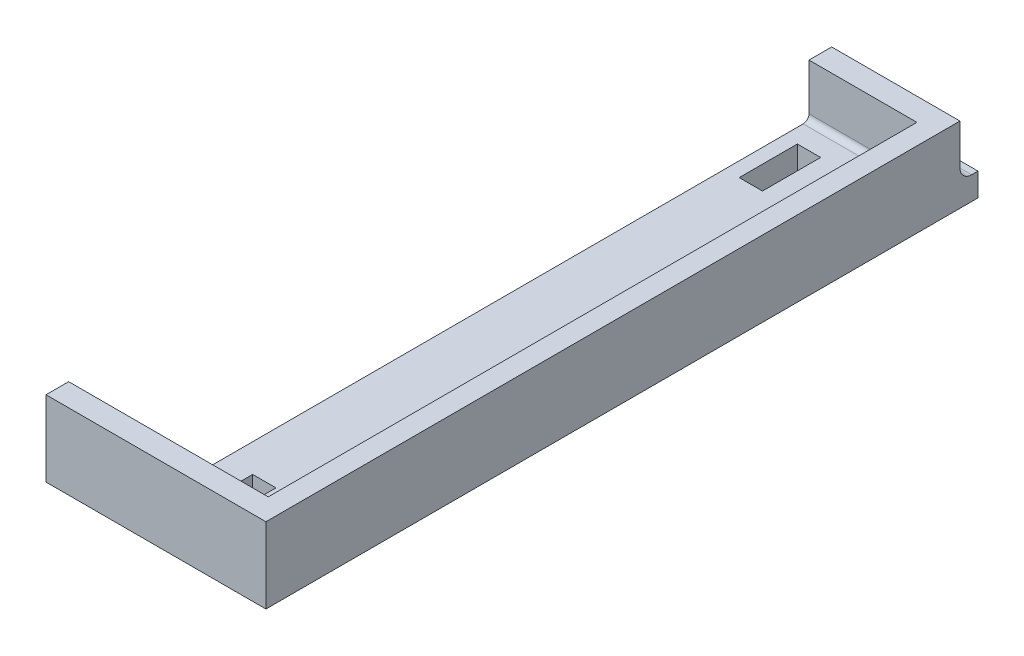
ISO-10303-21;
HEADER;
FILE_DESCRIPTION(('STEP AP214'),'2;1');
FILE_NAME('part.step','',(''),(''),'','','');
FILE_SCHEMA(('AUTOMOTIVE_DESIGN { 1 0 10303 214 1 1 1 1 }'));
ENDSEC;
DATA;
#1=APPLICATION_CONTEXT('core data for automotive mechanical design processes');
#2=APPLICATION_PROTOCOL_DEFINITION('international standard','automotive_design',2000,#1);
#3=PRODUCT_CONTEXT('',#1,'mechanical');
#4=PRODUCT('Part','Part','',(#3));
#5=PRODUCT_RELATED_PRODUCT_CATEGORY('part','',(#4));
#6=PRODUCT_DEFINITION_FORMATION('','',#4);
#7=PRODUCT_DEFINITION_CONTEXT('part definition',#1,'design');
#8=PRODUCT_DEFINITION('design','',#6,#7);
#9=PRODUCT_DEFINITION_SHAPE('','',#8);
#10=(LENGTH_UNIT() NAMED_UNIT(*) SI_UNIT(.MILLI.,.METRE.));
#11=(NAMED_UNIT(*) PLANE_ANGLE_UNIT() SI_UNIT($,.RADIAN.));
#12=(NAMED_UNIT(*) SI_UNIT($,.STERADIAN.) SOLID_ANGLE_UNIT());
#13=UNCERTAINTY_MEASURE_WITH_UNIT(LENGTH_MEASURE(1.E-05),#10,'distance_accuracy_value','');
#14=(GEOMETRIC_REPRESENTATION_CONTEXT(3) GLOBAL_UNCERTAINTY_ASSIGNED_CONTEXT((#13)) GLOBAL_UNIT_ASSIGNED_CONTEXT((#10,
#11,#12)) REPRESENTATION_CONTEXT('',''));
#15=CARTESIAN_POINT('',(0.,0.,0.));
#16=DIRECTION('',(0.,0.,1.));
#17=DIRECTION('',(1.,0.,0.));
#18=AXIS2_PLACEMENT_3D('',#15,#16,#17);
#19=CARTESIAN_POINT('',(15.75,-4.,-132.4));
#20=DIRECTION('',(-1.,0.,0.));
#21=DIRECTION('',(0.,0.,1.));
#22=AXIS2_PLACEMENT_3D('',#19,#20,#21);
#23=PLANE('',#22);
#24=DIRECTION('',(0.,0.,1.));
#25=VECTOR('',#24,1.);
#26=CARTESIAN_POINT('',(15.75,0.,-132.4));
#27=LINE('',#26,#25);
#28=CARTESIAN_POINT('',(15.75,0.,-122.4));
#29=VERTEX_POINT('',#28);
#30=CARTESIAN_POINT('',(15.75,0.,-121.3));
#31=VERTEX_POINT('',#30);
#32=EDGE_CURVE('E201',#29,#31,#27,.T.);
#33=ORIENTED_EDGE('',*,*,#32,.F.);
#34=DIRECTION('',(0.,-1.,0.));
#35=VECTOR('',#34,1.);
#36=CARTESIAN_POINT('',(15.75,-4.,-122.4));
#37=LINE('',#36,#35);
#38=CARTESIAN_POINT('',(15.75,-4.,-122.4));
#39=VERTEX_POINT('',#38);
#40=EDGE_CURVE('E48',#29,#39,#37,.T.);
#41=ORIENTED_EDGE('',*,*,#40,.T.);
#42=DIRECTION('',(0.,0.,1.));
#43=VECTOR('',#42,1.);
#44=CARTESIAN_POINT('',(15.75,-4.,-132.4));
#45=LINE('',#44,#43);
#46=CARTESIAN_POINT('',(15.75,-4.,-3.9));
#47=VERTEX_POINT('',#46);
#48=EDGE_CURVE('E308',#39,#47,#45,.T.);
#49=ORIENTED_EDGE('',*,*,#48,.T.);
#50=DIRECTION('',(0.,1.,0.));
#51=VECTOR('',#50,1.);
#52=CARTESIAN_POINT('',(15.75,-4.,-3.9));
#53=LINE('',#52,#51);
#54=CARTESIAN_POINT('',(15.75,1.,-3.90000000000001));
#55=VERTEX_POINT('',#54);
#56=EDGE_CURVE('E281',#47,#55,#53,.T.);
#57=ORIENTED_EDGE('',*,*,#56,.T.);
#58=CARTESIAN_POINT('',(15.75,1.,-4.9));
#59=DIRECTION('',(-1.,0.,0.));
#60=DIRECTION('',(0.,0.,1.));
#61=AXIS2_PLACEMENT_3D('',#58,#59,#60);
#62=CIRCLE('',#61,1.);
#63=CARTESIAN_POINT('',(15.75,0.,-4.90000000000002));
#64=VERTEX_POINT('',#63);
#65=EDGE_CURVE('E267',#64,#55,#62,.T.);
#66=ORIENTED_EDGE('',*,*,#65,.F.);
#67=CARTESIAN_POINT('',(15.75,0.,-114.4));
#68=VERTEX_POINT('',#67);
#69=EDGE_CURVE('E197',#68,#64,#27,.T.);
#70=ORIENTED_EDGE('',*,*,#69,.F.);
#71=CARTESIAN_POINT('',(15.75,1.,-114.4));
#72=DIRECTION('',(-1.,0.,0.));
#73=DIRECTION('',(0.,0.,1.));
#74=AXIS2_PLACEMENT_3D('',#71,#72,#73);
#75=CIRCLE('',#74,1.);
#76=CARTESIAN_POINT('',(15.75,1.,-115.4));
#77=VERTEX_POINT('',#76);
#78=EDGE_CURVE('E41',#77,#68,#75,.T.);
#79=ORIENTED_EDGE('',*,*,#78,.F.);
#80=DIRECTION('',(0.,-1.,0.));
#81=VECTOR('',#80,1.);
#82=CARTESIAN_POINT('',(15.75,9.,-115.4));
#83=LINE('',#82,#81);
#84=CARTESIAN_POINT('',(15.75,9.,-115.4));
#85=VERTEX_POINT('',#84);
#86=EDGE_CURVE('E295',#85,#77,#83,.T.);
#87=ORIENTED_EDGE('',*,*,#86,.F.);
#88=DIRECTION('',(0.,0.,1.));
#89=VECTOR('',#88,1.);
#90=CARTESIAN_POINT('',(15.75,9.,-115.4));
#91=LINE('',#90,#89);
#92=CARTESIAN_POINT('',(15.75,9.,-119.3));
#93=VERTEX_POINT('',#92);
#94=EDGE_CURVE('E340',#93,#85,#91,.T.);
#95=ORIENTED_EDGE('',*,*,#94,.F.);
#96=DIRECTION('',(0.,-1.,0.));
#97=VECTOR('',#96,1.);
#98=CARTESIAN_POINT('',(15.75,9.,-119.3));
#99=LINE('',#98,#97);
#100=CARTESIAN_POINT('',(15.75,2.,-119.3));
#101=VERTEX_POINT('',#100);
#102=EDGE_CURVE('E204',#93,#101,#99,.T.);
#103=ORIENTED_EDGE('',*,*,#102,.T.);
#104=CARTESIAN_POINT('',(15.75,2.,-121.3));
#105=DIRECTION('',(-1.,0.,0.));
#106=DIRECTION('',(0.,0.,1.));
#107=AXIS2_PLACEMENT_3D('',#104,#105,#106);
#108=CIRCLE('',#107,2.);
#109=EDGE_CURVE('E223',#31,#101,#108,.T.);
#110=ORIENTED_EDGE('',*,*,#109,.F.);
#111=EDGE_LOOP('',(#33,#41,#49,#57,#66,#70,#79,#87,#95,#103,#110));
#112=FACE_BOUND('',#111,.T.);
#113=ADVANCED_FACE('F33',(#112),#23,.T.);
#114=CARTESIAN_POINT('',(37.8,-4.,-129.4));
#115=DIRECTION('',(1.,0.,0.));
#116=DIRECTION('',(0.,0.,-1.));
#117=AXIS2_PLACEMENT_3D('',#114,#115,#116);
#118=PLANE('',#117);
#119=DIRECTION('',(0.,0.,-1.));
#120=VECTOR('',#119,1.);
#121=CARTESIAN_POINT('',(37.8,-4.,0.));
#122=LINE('',#121,#120);
#123=CARTESIAN_POINT('',(37.8,-4.,0.));
#124=VERTEX_POINT('',#123);
#125=CARTESIAN_POINT('',(37.8,-4.,-122.4));
#126=VERTEX_POINT('',#125);
#127=EDGE_CURVE('E191',#124,#126,#122,.T.);
#128=ORIENTED_EDGE('',*,*,#127,.T.);
#129=DIRECTION('',(0.,1.,0.));
#130=VECTOR('',#129,1.);
#131=CARTESIAN_POINT('',(37.8,-4.,-122.4));
#132=LINE('',#131,#130);
#133=CARTESIAN_POINT('',(37.8,0.,-122.4));
#134=VERTEX_POINT('',#133);
#135=EDGE_CURVE('E180',#126,#134,#132,.T.);
#136=ORIENTED_EDGE('',*,*,#135,.T.);
#137=DIRECTION('',(0.,0.,-1.));
#138=VECTOR('',#137,1.);
#139=CARTESIAN_POINT('',(37.8,0.,-129.4));
#140=LINE('',#139,#138);
#141=CARTESIAN_POINT('',(37.8,0.,-121.3));
#142=VERTEX_POINT('',#141);
#143=EDGE_CURVE('E189',#142,#134,#140,.T.);
#144=ORIENTED_EDGE('',*,*,#143,.F.);
#145=CARTESIAN_POINT('',(37.8,2.,-121.3));
#146=DIRECTION('',(1.,0.,0.));
#147=DIRECTION('',(0.,0.,-1.));
#148=AXIS2_PLACEMENT_3D('',#145,#146,#147);
#149=CIRCLE('',#148,2.);
#150=CARTESIAN_POINT('',(37.8,2.,-119.3));
#151=VERTEX_POINT('',#150);
#152=EDGE_CURVE('E221',#151,#142,#149,.T.);
#153=ORIENTED_EDGE('',*,*,#152,.F.);
#154=DIRECTION('',(0.,-1.,0.));
#155=VECTOR('',#154,1.);
#156=CARTESIAN_POINT('',(37.8,9.,-119.3));
#157=LINE('',#156,#155);
#158=CARTESIAN_POINT('',(37.8,9.,-119.3));
#159=VERTEX_POINT('',#158);
#160=EDGE_CURVE('E198',#159,#151,#157,.T.);
#161=ORIENTED_EDGE('',*,*,#160,.F.);
#162=DIRECTION('',(0.,0.,-1.));
#163=VECTOR('',#162,1.);
#164=CARTESIAN_POINT('',(37.8,9.,-119.3));
#165=LINE('',#164,#163);
#166=CARTESIAN_POINT('',(37.8,9.,0.));
#167=VERTEX_POINT('',#166);
#168=EDGE_CURVE('E330',#167,#159,#165,.T.);
#169=ORIENTED_EDGE('',*,*,#168,.F.);
#170=DIRECTION('',(0.,1.,0.));
#171=VECTOR('',#170,1.);
#172=CARTESIAN_POINT('',(37.8,-4.,0.));
#173=LINE('',#172,#171);
#174=EDGE_CURVE('E216',#124,#167,#173,.T.);
#175=ORIENTED_EDGE('',*,*,#174,.F.);
#176=EDGE_LOOP('',(#128,#136,#144,#153,#161,#169,#175));
#177=FACE_BOUND('',#176,.T.);
#178=ADVANCED_FACE('F188',(#177),#118,.T.);
#179=CARTESIAN_POINT('',(0.,-4.,0.));
#180=DIRECTION('',(0.,1.,0.));
#181=DIRECTION('',(0.,0.,1.));
#182=AXIS2_PLACEMENT_3D('',#179,#180,#181);
#183=PLANE('',#182);
#184=DIRECTION('',(-1.,0.,0.));
#185=VECTOR('',#184,1.);
#186=CARTESIAN_POINT('',(0.,-4.,-14.9));
#187=LINE('',#186,#185);
#188=CARTESIAN_POINT('',(24.6202204130949,-4.,-14.9));
#189=VERTEX_POINT('',#188);
#190=CARTESIAN_POINT('',(20.6202204130949,-4.,-14.9));
#191=VERTEX_POINT('',#190);
#192=EDGE_CURVE('E231',#189,#191,#187,.T.);
#193=ORIENTED_EDGE('',*,*,#192,.T.);
#194=DIRECTION('',(-4.42680325529367E-05,0.,0.999999999020171));
#195=VECTOR('',#194,1.);
#196=CARTESIAN_POINT('',(20.6195607790019,-4.,0.000912787388686487));
#197=LINE('',#196,#195);
#198=CARTESIAN_POINT('',(20.6197795869051,-4.,-4.9418843150546));
#199=VERTEX_POINT('',#198);
#200=EDGE_CURVE('E234',#191,#199,#197,.T.);
#201=ORIENTED_EDGE('',*,*,#200,.T.);
#202=DIRECTION('',(1.,0.,0.));
#203=VECTOR('',#202,1.);
#204=CARTESIAN_POINT('',(0.,-4.,-4.9418843150546));
#205=LINE('',#204,#203);
#206=CARTESIAN_POINT('',(24.6197795869051,-4.,-4.9418843150546));
#207=VERTEX_POINT('',#206);
#208=EDGE_CURVE('E225',#199,#207,#205,.T.);
#209=ORIENTED_EDGE('',*,*,#208,.T.);
#210=DIRECTION('',(4.42680325529367E-05,0.,-0.999999999020171));
#211=VECTOR('',#210,1.);
#212=CARTESIAN_POINT('',(24.6195607711632,-4.,0.00108985951872473));
#213=LINE('',#212,#211);
#214=EDGE_CURVE('E228',#207,#189,#213,.T.);
#215=ORIENTED_EDGE('',*,*,#214,.T.);
#216=EDGE_LOOP('',(#193,#201,#209,#215));
#217=FACE_BOUND('',#216,.T.);
#218=DIRECTION('',(1.,0.,0.));
#219=VECTOR('',#218,1.);
#220=CARTESIAN_POINT('',(0.,-4.,-100.9));
#221=LINE('',#220,#219);
#222=CARTESIAN_POINT('',(18.25,-4.,-100.9));
#223=VERTEX_POINT('',#222);
#224=CARTESIAN_POINT('',(22.25,-4.,-100.9));
#225=VERTEX_POINT('',#224);
#226=EDGE_CURVE('E243',#223,#225,#221,.T.);
#227=ORIENTED_EDGE('',*,*,#226,.T.);
#228=DIRECTION('',(0.,0.,-1.));
#229=VECTOR('',#228,1.);
#230=CARTESIAN_POINT('',(22.25,-4.,0.));
#231=LINE('',#230,#229);
#232=CARTESIAN_POINT('',(22.25,-4.,-110.9));
#233=VERTEX_POINT('',#232);
#234=EDGE_CURVE('E246',#225,#233,#231,.T.);
#235=ORIENTED_EDGE('',*,*,#234,.T.);
#236=DIRECTION('',(-1.,0.,0.));
#237=VECTOR('',#236,1.);
#238=CARTESIAN_POINT('',(0.,-4.,-110.9));
#239=LINE('',#238,#237);
#240=CARTESIAN_POINT('',(18.25,-4.,-110.9));
#241=VERTEX_POINT('',#240);
#242=EDGE_CURVE('E237',#233,#241,#239,.T.);
#243=ORIENTED_EDGE('',*,*,#242,.T.);
#244=DIRECTION('',(0.,0.,1.));
#245=VECTOR('',#244,1.);
#246=CARTESIAN_POINT('',(18.25,-4.,0.));
#247=LINE('',#246,#245);
#248=EDGE_CURVE('E240',#241,#223,#247,.T.);
#249=ORIENTED_EDGE('',*,*,#248,.T.);
#250=EDGE_LOOP('',(#227,#235,#243,#249));
#251=FACE_BOUND('',#250,.T.);
#252=DIRECTION('',(-1.,0.,0.));
#253=VECTOR('',#252,1.);
#254=CARTESIAN_POINT('',(0.,-4.,-122.4));
#255=LINE('',#254,#253);
#256=EDGE_CURVE('E634',#126,#39,#255,.T.);
#257=ORIENTED_EDGE('',*,*,#256,.F.);
#258=ORIENTED_EDGE('',*,*,#127,.F.);
#259=DIRECTION('',(1.,0.,0.));
#260=VECTOR('',#259,1.);
#261=CARTESIAN_POINT('',(0.,-4.,0.));
#262=LINE('',#261,#260);
#263=CARTESIAN_POINT('',(0.,-4.,0.));
#264=VERTEX_POINT('',#263);
#265=EDGE_CURVE('E210',#264,#124,#262,.T.);
#266=ORIENTED_EDGE('',*,*,#265,.F.);
#267=DIRECTION('',(0.,0.,1.));
#268=VECTOR('',#267,1.);
#269=CARTESIAN_POINT('',(0.,-4.,0.));
#270=LINE('',#269,#268);
#271=CARTESIAN_POINT('',(0.,-4.,-3.9));
#272=VERTEX_POINT('',#271);
#273=EDGE_CURVE('E207',#272,#264,#270,.T.);
#274=ORIENTED_EDGE('',*,*,#273,.F.);
#275=DIRECTION('',(-1.,0.,0.));
#276=VECTOR('',#275,1.);
#277=CARTESIAN_POINT('',(0.,-4.,-3.9));
#278=LINE('',#277,#276);
#279=EDGE_CURVE('E309',#47,#272,#278,.T.);
#280=ORIENTED_EDGE('',*,*,#279,.F.);
#281=ORIENTED_EDGE('',*,*,#48,.F.);
#282=EDGE_LOOP('',(#257,#258,#266,#274,#280,#281));
#283=FACE_BOUND('',#282,.T.);
#284=ADVANCED_FACE('F321',(#217,#251,#283),#183,.F.);
#285=CARTESIAN_POINT('',(0.,0.,0.));
#286=DIRECTION('',(0.,1.,0.));
#287=DIRECTION('',(0.,0.,1.));
#288=AXIS2_PLACEMENT_3D('',#285,#286,#287);
#289=PLANE('',#288);
#290=ORIENTED_EDGE('',*,*,#143,.T.);
#291=DIRECTION('',(-1.,0.,0.));
#292=VECTOR('',#291,1.);
#293=CARTESIAN_POINT('',(0.,0.,-122.4));
#294=LINE('',#293,#292);
#295=EDGE_CURVE('E11',#134,#29,#294,.T.);
#296=ORIENTED_EDGE('',*,*,#295,.T.);
#297=ORIENTED_EDGE('',*,*,#32,.T.);
#298=DIRECTION('',(-1.,0.,0.));
#299=VECTOR('',#298,1.);
#300=CARTESIAN_POINT('',(0.,0.,-121.3));
#301=LINE('',#300,#299);
#302=EDGE_CURVE('E196',#31,#142,#301,.F.);
#303=ORIENTED_EDGE('',*,*,#302,.T.);
#304=EDGE_LOOP('',(#290,#296,#297,#303));
#305=FACE_BOUND('',#304,.T.);
#306=ADVANCED_FACE('F194',(#305),#289,.T.);
#307=CARTESIAN_POINT('',(33.3,1.,0.));
#308=DIRECTION('',(0.,0.,-1.));
#309=DIRECTION('',(-1.,0.,0.));
#310=AXIS2_PLACEMENT_3D('',#307,#308,#309);
#311=CYLINDRICAL_SURFACE('',#310,1.);
#312=CARTESIAN_POINT('',(33.3,1.,-114.4));
#313=DIRECTION('',(-0.707106781186548,0.,-0.707106781186547));
#314=DIRECTION('',(0.707106781186547,0.,-0.707106781186548));
#315=AXIS2_PLACEMENT_3D('',#312,#313,#314);
#316=ELLIPSE('',#315,1.41421356237309,1.);
#317=CARTESIAN_POINT('',(33.3,0.,-114.4));
#318=VERTEX_POINT('',#317);
#319=CARTESIAN_POINT('',(34.3,1.,-115.4));
#320=VERTEX_POINT('',#319);
#321=EDGE_CURVE('E272',#318,#320,#316,.F.);
#322=ORIENTED_EDGE('',*,*,#321,.F.);
#323=DIRECTION('',(0.,0.,-1.));
#324=VECTOR('',#323,1.);
#325=CARTESIAN_POINT('',(33.3,0.,0.));
#326=LINE('',#325,#324);
#327=CARTESIAN_POINT('',(33.3,0.,-4.9));
#328=VERTEX_POINT('',#327);
#329=EDGE_CURVE('E252',#328,#318,#326,.T.);
#330=ORIENTED_EDGE('',*,*,#329,.F.);
#331=CARTESIAN_POINT('',(33.3,1.,-4.9));
#332=DIRECTION('',(-0.707106781186547,0.,0.707106781186548));
#333=DIRECTION('',(-0.707106781186548,0.,-0.707106781186547));
#334=AXIS2_PLACEMENT_3D('',#331,#332,#333);
#335=ELLIPSE('',#334,1.4142135623731,1.);
#336=CARTESIAN_POINT('',(34.3,1.,-3.9));
#337=VERTEX_POINT('',#336);
#338=EDGE_CURVE('E270',#328,#337,#335,.T.);
#339=ORIENTED_EDGE('',*,*,#338,.T.);
#340=DIRECTION('',(0.,0.,-1.));
#341=VECTOR('',#340,1.);
#342=CARTESIAN_POINT('',(34.3,0.999999999999999,-115.4));
#343=LINE('',#342,#341);
#344=EDGE_CURVE('E261',#320,#337,#343,.F.);
#345=ORIENTED_EDGE('',*,*,#344,.F.);
#346=EDGE_LOOP('',(#322,#330,#339,#345));
#347=FACE_BOUND('',#346,.T.);
#348=ADVANCED_FACE('F286',(#347),#311,.F.);
#349=CARTESIAN_POINT('',(0.,1.,-4.9));
#350=DIRECTION('',(-1.,0.,0.));
#351=DIRECTION('',(0.,0.,1.));
#352=AXIS2_PLACEMENT_3D('',#349,#350,#351);
#353=CYLINDRICAL_SURFACE('',#352,1.);
#354=ORIENTED_EDGE('',*,*,#338,.F.);
#355=DIRECTION('',(1.,0.,0.));
#356=VECTOR('',#355,1.);
#357=CARTESIAN_POINT('',(0.,0.,-4.9));
#358=LINE('',#357,#356);
#359=EDGE_CURVE('E255',#64,#328,#358,.T.);
#360=ORIENTED_EDGE('',*,*,#359,.F.);
#361=ORIENTED_EDGE('',*,*,#65,.T.);
#362=DIRECTION('',(1.,0.,0.));
#363=VECTOR('',#362,1.);
#364=CARTESIAN_POINT('',(0.,1.,-3.9));
#365=LINE('',#364,#363);
#366=EDGE_CURVE('E258',#337,#55,#365,.F.);
#367=ORIENTED_EDGE('',*,*,#366,.F.);
#368=EDGE_LOOP('',(#354,#360,#361,#367));
#369=FACE_BOUND('',#368,.T.);
#370=ADVANCED_FACE('F284',(#369),#353,.F.);
#371=CARTESIAN_POINT('',(0.,1.,-114.4));
#372=DIRECTION('',(-1.,0.,0.));
#373=DIRECTION('',(0.,0.,1.));
#374=AXIS2_PLACEMENT_3D('',#371,#372,#373);
#375=CYLINDRICAL_SURFACE('',#374,1.);
#376=DIRECTION('',(-1.,0.,0.));
#377=VECTOR('',#376,1.);
#378=CARTESIAN_POINT('',(0.,0.,-114.4));
#379=LINE('',#378,#377);
#380=EDGE_CURVE('E249',#318,#68,#379,.T.);
#381=ORIENTED_EDGE('',*,*,#380,.F.);
#382=ORIENTED_EDGE('',*,*,#321,.T.);
#383=DIRECTION('',(-1.,0.,0.));
#384=VECTOR('',#383,1.);
#385=CARTESIAN_POINT('',(34.3,0.999999999999999,-115.4));
#386=LINE('',#385,#384);
#387=EDGE_CURVE('E264',#77,#320,#386,.F.);
#388=ORIENTED_EDGE('',*,*,#387,.F.);
#389=ORIENTED_EDGE('',*,*,#78,.T.);
#390=EDGE_LOOP('',(#381,#382,#388,#389));
#391=FACE_BOUND('',#390,.T.);
#392=ADVANCED_FACE('F35',(#391),#375,.F.);
#393=CARTESIAN_POINT('',(0.,-4.,-3.9));
#394=DIRECTION('',(0.,0.,-1.));
#395=DIRECTION('',(-1.,0.,0.));
#396=AXIS2_PLACEMENT_3D('',#393,#394,#395);
#397=PLANE('',#396);
#398=DIRECTION('',(0.,-1.,0.));
#399=VECTOR('',#398,1.);
#400=CARTESIAN_POINT('',(34.3,9.,-3.9));
#401=LINE('',#400,#399);
#402=CARTESIAN_POINT('',(34.3,9.,-3.9));
#403=VERTEX_POINT('',#402);
#404=EDGE_CURVE('E301',#403,#337,#401,.T.);
#405=ORIENTED_EDGE('',*,*,#404,.T.);
#406=ORIENTED_EDGE('',*,*,#366,.T.);
#407=ORIENTED_EDGE('',*,*,#56,.F.);
#408=ORIENTED_EDGE('',*,*,#279,.T.);
#409=DIRECTION('',(0.,1.,0.));
#410=VECTOR('',#409,1.);
#411=CARTESIAN_POINT('',(0.,-4.,-3.9));
#412=LINE('',#411,#410);
#413=CARTESIAN_POINT('',(0.,9.,-3.9));
#414=VERTEX_POINT('',#413);
#415=EDGE_CURVE('E214',#272,#414,#412,.T.);
#416=ORIENTED_EDGE('',*,*,#415,.T.);
#417=DIRECTION('',(-1.,0.,0.));
#418=VECTOR('',#417,1.);
#419=CARTESIAN_POINT('',(34.3,9.,-3.9));
#420=LINE('',#419,#418);
#421=EDGE_CURVE('E335',#403,#414,#420,.T.);
#422=ORIENTED_EDGE('',*,*,#421,.F.);
#423=EDGE_LOOP('',(#405,#406,#407,#408,#416,#422));
#424=FACE_BOUND('',#423,.T.);
#425=ADVANCED_FACE('F347',(#424),#397,.T.);
#426=CARTESIAN_POINT('',(15.75,2.,-121.3));
#427=DIRECTION('',(-1.,0.,0.));
#428=DIRECTION('',(0.,0.,1.));
#429=AXIS2_PLACEMENT_3D('',#426,#427,#428);
#430=CYLINDRICAL_SURFACE('',#429,2.);
#431=DIRECTION('',(-1.,0.,0.));
#432=VECTOR('',#431,1.);
#433=CARTESIAN_POINT('',(15.75,2.,-119.3));
#434=LINE('',#433,#432);
#435=EDGE_CURVE('E213',#151,#101,#434,.T.);
#436=ORIENTED_EDGE('',*,*,#435,.F.);
#437=ORIENTED_EDGE('',*,*,#152,.T.);
#438=ORIENTED_EDGE('',*,*,#302,.F.);
#439=ORIENTED_EDGE('',*,*,#109,.T.);
#440=EDGE_LOOP('',(#436,#437,#438,#439));
#441=FACE_BOUND('',#440,.T.);
#442=ADVANCED_FACE('F360',(#441),#430,.F.);
#443=DIRECTION('',(0.,0.,-1.));
#444=VECTOR('',#443,1.);
#445=CARTESIAN_POINT('',(22.25,0.,-110.9));
#446=LINE('',#445,#444);
#447=CARTESIAN_POINT('',(22.25,0.,-100.9));
#448=VERTEX_POINT('',#447);
#449=CARTESIAN_POINT('',(22.25,0.,-110.9));
#450=VERTEX_POINT('',#449);
#451=EDGE_CURVE('E622',#448,#450,#446,.T.);
#452=ORIENTED_EDGE('',*,*,#451,.F.);
#453=DIRECTION('',(1.,0.,0.));
#454=VECTOR('',#453,1.);
#455=CARTESIAN_POINT('',(18.25,0.,-100.9));
#456=LINE('',#455,#454);
#457=CARTESIAN_POINT('',(18.25,0.,-100.9));
#458=VERTEX_POINT('',#457);
#459=EDGE_CURVE('E609',#458,#448,#456,.T.);
#460=ORIENTED_EDGE('',*,*,#459,.F.);
#461=DIRECTION('',(0.,0.,1.));
#462=VECTOR('',#461,1.);
#463=CARTESIAN_POINT('',(18.25,0.,-100.9));
#464=LINE('',#463,#462);
#465=CARTESIAN_POINT('',(18.25,0.,-110.9));
#466=VERTEX_POINT('',#465);
#467=EDGE_CURVE('E616',#466,#458,#464,.T.);
#468=ORIENTED_EDGE('',*,*,#467,.F.);
#469=DIRECTION('',(-1.,0.,0.));
#470=VECTOR('',#469,1.);
#471=CARTESIAN_POINT('',(18.25,0.,-110.9));
#472=LINE('',#471,#470);
#473=EDGE_CURVE('E619',#450,#466,#472,.T.);
#474=ORIENTED_EDGE('',*,*,#473,.F.);
#475=EDGE_LOOP('',(#452,#460,#468,#474));
#476=FACE_BOUND('',#475,.T.);
#477=DIRECTION('',(-4.42680325529367E-05,0.,0.999999999020171));
#478=VECTOR('',#477,1.);
#479=CARTESIAN_POINT('',(20.6197795869051,0.,-4.9418843150546));
#480=LINE('',#479,#478);
#481=CARTESIAN_POINT('',(20.6202204130949,0.,-14.9));
#482=VERTEX_POINT('',#481);
#483=CARTESIAN_POINT('',(20.6197795869051,0.,-4.9418843150546));
#484=VERTEX_POINT('',#483);
#485=EDGE_CURVE('E631',#482,#484,#480,.T.);
#486=ORIENTED_EDGE('',*,*,#485,.F.);
#487=DIRECTION('',(-1.,0.,0.));
#488=VECTOR('',#487,1.);
#489=CARTESIAN_POINT('',(20.6202204130949,0.,-14.9));
#490=LINE('',#489,#488);
#491=CARTESIAN_POINT('',(24.6202204130949,0.,-14.9));
#492=VERTEX_POINT('',#491);
#493=EDGE_CURVE('E640',#492,#482,#490,.T.);
#494=ORIENTED_EDGE('',*,*,#493,.F.);
#495=DIRECTION('',(4.42680325529367E-05,0.,-0.999999999020171));
#496=VECTOR('',#495,1.);
#497=CARTESIAN_POINT('',(24.6202204130949,0.,-14.9));
#498=LINE('',#497,#496);
#499=CARTESIAN_POINT('',(24.6197795869051,0.,-4.9418843150546));
#500=VERTEX_POINT('',#499);
#501=EDGE_CURVE('E637',#500,#492,#498,.T.);
#502=ORIENTED_EDGE('',*,*,#501,.F.);
#503=DIRECTION('',(1.,0.,0.));
#504=VECTOR('',#503,1.);
#505=CARTESIAN_POINT('',(24.6197795869051,0.,-4.9418843150546));
#506=LINE('',#505,#504);
#507=EDGE_CURVE('E633',#484,#500,#506,.T.);
#508=ORIENTED_EDGE('',*,*,#507,.F.);
#509=EDGE_LOOP('',(#486,#494,#502,#508));
#510=FACE_BOUND('',#509,.T.);
#511=ORIENTED_EDGE('',*,*,#69,.T.);
#512=ORIENTED_EDGE('',*,*,#359,.T.);
#513=ORIENTED_EDGE('',*,*,#329,.T.);
#514=ORIENTED_EDGE('',*,*,#380,.T.);
#515=EDGE_LOOP('',(#511,#512,#513,#514));
#516=FACE_BOUND('',#515,.T.);
#517=ADVANCED_FACE('F277',(#476,#510,#516),#289,.T.);
#518=CARTESIAN_POINT('',(0.,-4.,0.));
#519=DIRECTION('',(0.,0.,1.));
#520=DIRECTION('',(1.,0.,0.));
#521=AXIS2_PLACEMENT_3D('',#518,#519,#520);
#522=PLANE('',#521);
#523=ORIENTED_EDGE('',*,*,#174,.T.);
#524=DIRECTION('',(1.,0.,0.));
#525=VECTOR('',#524,1.);
#526=CARTESIAN_POINT('',(0.,9.,0.));
#527=LINE('',#526,#525);
#528=CARTESIAN_POINT('',(0.,9.,0.));
#529=VERTEX_POINT('',#528);
#530=EDGE_CURVE('E327',#529,#167,#527,.T.);
#531=ORIENTED_EDGE('',*,*,#530,.F.);
#532=DIRECTION('',(0.,1.,0.));
#533=VECTOR('',#532,1.);
#534=CARTESIAN_POINT('',(0.,-4.,0.));
#535=LINE('',#534,#533);
#536=EDGE_CURVE('E211',#264,#529,#535,.T.);
#537=ORIENTED_EDGE('',*,*,#536,.F.);
#538=ORIENTED_EDGE('',*,*,#265,.T.);
#539=EDGE_LOOP('',(#523,#531,#537,#538));
#540=FACE_BOUND('',#539,.T.);
#541=ADVANCED_FACE('F324',(#540),#522,.T.);
#542=CARTESIAN_POINT('',(0.,-4.,0.));
#543=DIRECTION('',(-1.,0.,0.));
#544=DIRECTION('',(0.,0.,1.));
#545=AXIS2_PLACEMENT_3D('',#542,#543,#544);
#546=PLANE('',#545);
#547=ORIENTED_EDGE('',*,*,#536,.T.);
#548=DIRECTION('',(0.,0.,1.));
#549=VECTOR('',#548,1.);
#550=CARTESIAN_POINT('',(0.,9.,-3.9));
#551=LINE('',#550,#549);
#552=EDGE_CURVE('E331',#414,#529,#551,.T.);
#553=ORIENTED_EDGE('',*,*,#552,.F.);
#554=ORIENTED_EDGE('',*,*,#415,.F.);
#555=ORIENTED_EDGE('',*,*,#273,.T.);
#556=EDGE_LOOP('',(#547,#553,#554,#555));
#557=FACE_BOUND('',#556,.T.);
#558=ADVANCED_FACE('F316',(#557),#546,.T.);
#559=CARTESIAN_POINT('',(15.75,9.,-119.3));
#560=DIRECTION('',(0.,0.,1.));
#561=DIRECTION('',(1.,0.,0.));
#562=AXIS2_PLACEMENT_3D('',#559,#560,#561);
#563=PLANE('',#562);
#564=ORIENTED_EDGE('',*,*,#160,.T.);
#565=ORIENTED_EDGE('',*,*,#435,.T.);
#566=ORIENTED_EDGE('',*,*,#102,.F.);
#567=DIRECTION('',(-1.,0.,0.));
#568=VECTOR('',#567,1.);
#569=CARTESIAN_POINT('',(15.75,9.,-119.3));
#570=LINE('',#569,#568);
#571=EDGE_CURVE('E333',#159,#93,#570,.T.);
#572=ORIENTED_EDGE('',*,*,#571,.F.);
#573=EDGE_LOOP('',(#564,#565,#566,#572));
#574=FACE_BOUND('',#573,.T.);
#575=ADVANCED_FACE('F356',(#574),#563,.F.);
#576=CARTESIAN_POINT('',(34.3,9.,-115.4));
#577=DIRECTION('',(0.,0.,-1.));
#578=DIRECTION('',(-1.,0.,0.));
#579=AXIS2_PLACEMENT_3D('',#576,#577,#578);
#580=PLANE('',#579);
#581=ORIENTED_EDGE('',*,*,#86,.T.);
#582=ORIENTED_EDGE('',*,*,#387,.T.);
#583=DIRECTION('',(0.,-1.,0.));
#584=VECTOR('',#583,1.);
#585=CARTESIAN_POINT('',(34.3,9.,-115.4));
#586=LINE('',#585,#584);
#587=CARTESIAN_POINT('',(34.3,9.,-115.4));
#588=VERTEX_POINT('',#587);
#589=EDGE_CURVE('E293',#588,#320,#586,.T.);
#590=ORIENTED_EDGE('',*,*,#589,.F.);
#591=DIRECTION('',(1.,0.,0.));
#592=VECTOR('',#591,1.);
#593=CARTESIAN_POINT('',(34.3,9.,-115.4));
#594=LINE('',#593,#592);
#595=EDGE_CURVE('E296',#85,#588,#594,.T.);
#596=ORIENTED_EDGE('',*,*,#595,.F.);
#597=EDGE_LOOP('',(#581,#582,#590,#596));
#598=FACE_BOUND('',#597,.T.);
#599=ADVANCED_FACE('F291',(#598),#580,.F.);
#600=CARTESIAN_POINT('',(34.3,9.,-115.4));
#601=DIRECTION('',(1.,0.,0.));
#602=DIRECTION('',(0.,0.,-1.));
#603=AXIS2_PLACEMENT_3D('',#600,#601,#602);
#604=PLANE('',#603);
#605=ORIENTED_EDGE('',*,*,#589,.T.);
#606=ORIENTED_EDGE('',*,*,#344,.T.);
#607=ORIENTED_EDGE('',*,*,#404,.F.);
#608=DIRECTION('',(0.,0.,1.));
#609=VECTOR('',#608,1.);
#610=CARTESIAN_POINT('',(34.3,9.,-115.4));
#611=LINE('',#610,#609);
#612=EDGE_CURVE('E343',#588,#403,#611,.T.);
#613=ORIENTED_EDGE('',*,*,#612,.F.);
#614=EDGE_LOOP('',(#605,#606,#607,#613));
#615=FACE_BOUND('',#614,.T.);
#616=ADVANCED_FACE('F350',(#615),#604,.F.);
#617=CARTESIAN_POINT('',(0.,9.,0.));
#618=DIRECTION('',(0.,1.,0.));
#619=DIRECTION('',(0.,0.,1.));
#620=AXIS2_PLACEMENT_3D('',#617,#618,#619);
#621=PLANE('',#620);
#622=ORIENTED_EDGE('',*,*,#421,.T.);
#623=ORIENTED_EDGE('',*,*,#552,.T.);
#624=ORIENTED_EDGE('',*,*,#530,.T.);
#625=ORIENTED_EDGE('',*,*,#168,.T.);
#626=ORIENTED_EDGE('',*,*,#571,.T.);
#627=ORIENTED_EDGE('',*,*,#94,.T.);
#628=ORIENTED_EDGE('',*,*,#595,.T.);
#629=ORIENTED_EDGE('',*,*,#612,.T.);
#630=EDGE_LOOP('',(#622,#623,#624,#625,#626,#627,#628,#629));
#631=FACE_BOUND('',#630,.T.);
#632=ADVANCED_FACE('F351',(#631),#621,.T.);
#633=CARTESIAN_POINT('',(20.6197795869051,-10.,-4.9418843150546));
#634=DIRECTION('',(-0.999999999020171,0.,-4.42680325529367E-05));
#635=DIRECTION('',(-4.42680325529367E-05,0.,0.999999999020171));
#636=AXIS2_PLACEMENT_3D('',#633,#634,#635);
#637=PLANE('',#636);
#638=DIRECTION('',(0.,1.,0.));
#639=VECTOR('',#638,1.);
#640=CARTESIAN_POINT('',(20.6202204130949,-10.,-14.9));
#641=LINE('',#640,#639);
#642=EDGE_CURVE('E644',#191,#482,#641,.T.);
#643=ORIENTED_EDGE('',*,*,#642,.T.);
#644=ORIENTED_EDGE('',*,*,#485,.T.);
#645=DIRECTION('',(0.,1.,0.));
#646=VECTOR('',#645,1.);
#647=CARTESIAN_POINT('',(20.6197795869051,-10.,-4.9418843150546));
#648=LINE('',#647,#646);
#649=EDGE_CURVE('E643',#199,#484,#648,.T.);
#650=ORIENTED_EDGE('',*,*,#649,.F.);
#651=ORIENTED_EDGE('',*,*,#200,.F.);
#652=EDGE_LOOP('',(#643,#644,#650,#651));
#653=FACE_BOUND('',#652,.T.);
#654=ADVANCED_FACE('F398',(#653),#637,.F.);
#655=CARTESIAN_POINT('',(20.6202204130949,-10.,-14.9));
#656=DIRECTION('',(0.,0.,-1.));
#657=DIRECTION('',(-1.,0.,0.));
#658=AXIS2_PLACEMENT_3D('',#655,#656,#657);
#659=PLANE('',#658);
#660=DIRECTION('',(0.,1.,0.));
#661=VECTOR('',#660,1.);
#662=CARTESIAN_POINT('',(24.6202204130949,-10.,-14.9));
#663=LINE('',#662,#661);
#664=EDGE_CURVE('E646',#189,#492,#663,.T.);
#665=ORIENTED_EDGE('',*,*,#664,.T.);
#666=ORIENTED_EDGE('',*,*,#493,.T.);
#667=ORIENTED_EDGE('',*,*,#642,.F.);
#668=ORIENTED_EDGE('',*,*,#192,.F.);
#669=EDGE_LOOP('',(#665,#666,#667,#668));
#670=FACE_BOUND('',#669,.T.);
#671=ADVANCED_FACE('F401',(#670),#659,.F.);
#672=CARTESIAN_POINT('',(24.6202204130949,-10.,-14.9));
#673=DIRECTION('',(0.999999999020171,0.,4.42680325529367E-05));
#674=DIRECTION('',(4.42680325529367E-05,0.,-0.999999999020171));
#675=AXIS2_PLACEMENT_3D('',#672,#673,#674);
#676=PLANE('',#675);
#677=DIRECTION('',(0.,1.,0.));
#678=VECTOR('',#677,1.);
#679=CARTESIAN_POINT('',(24.6197795869051,-10.,-4.9418843150546));
#680=LINE('',#679,#678);
#681=EDGE_CURVE('E648',#207,#500,#680,.T.);
#682=ORIENTED_EDGE('',*,*,#681,.T.);
#683=ORIENTED_EDGE('',*,*,#501,.T.);
#684=ORIENTED_EDGE('',*,*,#664,.F.);
#685=ORIENTED_EDGE('',*,*,#214,.F.);
#686=EDGE_LOOP('',(#682,#683,#684,#685));
#687=FACE_BOUND('',#686,.T.);
#688=ADVANCED_FACE('F407',(#687),#676,.F.);
#689=CARTESIAN_POINT('',(24.6197795869051,-10.,-4.9418843150546));
#690=DIRECTION('',(0.,0.,1.));
#691=DIRECTION('',(1.,0.,0.));
#692=AXIS2_PLACEMENT_3D('',#689,#690,#691);
#693=PLANE('',#692);
#694=ORIENTED_EDGE('',*,*,#649,.T.);
#695=ORIENTED_EDGE('',*,*,#507,.T.);
#696=ORIENTED_EDGE('',*,*,#681,.F.);
#697=ORIENTED_EDGE('',*,*,#208,.F.);
#698=EDGE_LOOP('',(#694,#695,#696,#697));
#699=FACE_BOUND('',#698,.T.);
#700=ADVANCED_FACE('F403',(#699),#693,.F.);
#701=CARTESIAN_POINT('',(22.25,-10.,-110.9));
#702=DIRECTION('',(1.,0.,0.));
#703=DIRECTION('',(0.,0.,-1.));
#704=AXIS2_PLACEMENT_3D('',#701,#702,#703);
#705=PLANE('',#704);
#706=DIRECTION('',(0.,1.,0.));
#707=VECTOR('',#706,1.);
#708=CARTESIAN_POINT('',(22.25,-10.,-100.9));
#709=LINE('',#708,#707);
#710=EDGE_CURVE('E612',#225,#448,#709,.T.);
#711=ORIENTED_EDGE('',*,*,#710,.T.);
#712=ORIENTED_EDGE('',*,*,#451,.T.);
#713=DIRECTION('',(0.,1.,0.));
#714=VECTOR('',#713,1.);
#715=CARTESIAN_POINT('',(22.25,-10.,-110.9));
#716=LINE('',#715,#714);
#717=EDGE_CURVE('E623',#233,#450,#716,.T.);
#718=ORIENTED_EDGE('',*,*,#717,.F.);
#719=ORIENTED_EDGE('',*,*,#234,.F.);
#720=EDGE_LOOP('',(#711,#712,#718,#719));
#721=FACE_BOUND('',#720,.T.);
#722=ADVANCED_FACE('F406',(#721),#705,.F.);
#723=CARTESIAN_POINT('',(18.25,-10.,-100.9));
#724=DIRECTION('',(0.,0.,1.));
#725=DIRECTION('',(1.,0.,0.));
#726=AXIS2_PLACEMENT_3D('',#723,#724,#725);
#727=PLANE('',#726);
#728=DIRECTION('',(0.,1.,0.));
#729=VECTOR('',#728,1.);
#730=CARTESIAN_POINT('',(18.25,-10.,-100.9));
#731=LINE('',#730,#729);
#732=EDGE_CURVE('E605',#223,#458,#731,.T.);
#733=ORIENTED_EDGE('',*,*,#732,.T.);
#734=ORIENTED_EDGE('',*,*,#459,.T.);
#735=ORIENTED_EDGE('',*,*,#710,.F.);
#736=ORIENTED_EDGE('',*,*,#226,.F.);
#737=EDGE_LOOP('',(#733,#734,#735,#736));
#738=FACE_BOUND('',#737,.T.);
#739=ADVANCED_FACE('F417',(#738),#727,.F.);
#740=CARTESIAN_POINT('',(18.25,-10.,-100.9));
#741=DIRECTION('',(-1.,0.,0.));
#742=DIRECTION('',(0.,0.,1.));
#743=AXIS2_PLACEMENT_3D('',#740,#741,#742);
#744=PLANE('',#743);
#745=DIRECTION('',(0.,1.,0.));
#746=VECTOR('',#745,1.);
#747=CARTESIAN_POINT('',(18.25,-10.,-110.9));
#748=LINE('',#747,#746);
#749=EDGE_CURVE('E613',#241,#466,#748,.T.);
#750=ORIENTED_EDGE('',*,*,#749,.T.);
#751=ORIENTED_EDGE('',*,*,#467,.T.);
#752=ORIENTED_EDGE('',*,*,#732,.F.);
#753=ORIENTED_EDGE('',*,*,#248,.F.);
#754=EDGE_LOOP('',(#750,#751,#752,#753));
#755=FACE_BOUND('',#754,.T.);
#756=ADVANCED_FACE('F422',(#755),#744,.F.);
#757=CARTESIAN_POINT('',(18.25,-10.,-110.9));
#758=DIRECTION('',(0.,0.,-1.));
#759=DIRECTION('',(-1.,0.,0.));
#760=AXIS2_PLACEMENT_3D('',#757,#758,#759);
#761=PLANE('',#760);
#762=ORIENTED_EDGE('',*,*,#717,.T.);
#763=ORIENTED_EDGE('',*,*,#473,.T.);
#764=ORIENTED_EDGE('',*,*,#749,.F.);
#765=ORIENTED_EDGE('',*,*,#242,.F.);
#766=EDGE_LOOP('',(#762,#763,#764,#765));
#767=FACE_BOUND('',#766,.T.);
#768=ADVANCED_FACE('F419',(#767),#761,.F.);
#769=CARTESIAN_POINT('',(0.,0.,-122.4));
#770=DIRECTION('',(0.,0.,-1.));
#771=DIRECTION('',(-1.,0.,0.));
#772=AXIS2_PLACEMENT_3D('',#769,#770,#771);
#773=PLANE('',#772);
#774=ORIENTED_EDGE('',*,*,#256,.T.);
#775=ORIENTED_EDGE('',*,*,#40,.F.);
#776=ORIENTED_EDGE('',*,*,#295,.F.);
#777=ORIENTED_EDGE('',*,*,#135,.F.);
#778=EDGE_LOOP('',(#774,#775,#776,#777));
#779=FACE_BOUND('',#778,.T.);
#780=ADVANCED_FACE('F179',(#779),#773,.T.);
#781=CLOSED_SHELL('',(#113,#178,#284,#306,#348,#370,#392,#425,#442,#517,#541,#558,#575,#599,
#616,#632,#654,#671,#688,#700,#722,#739,#756,#768,#780));
#782=MANIFOLD_SOLID_BREP('B2',#781);
#783=ADVANCED_BREP_SHAPE_REPRESENTATION('',(#18,#782),#14);
#784=SHAPE_DEFINITION_REPRESENTATION(#9,#783);
ENDSEC;
END-ISO-10303-21;
